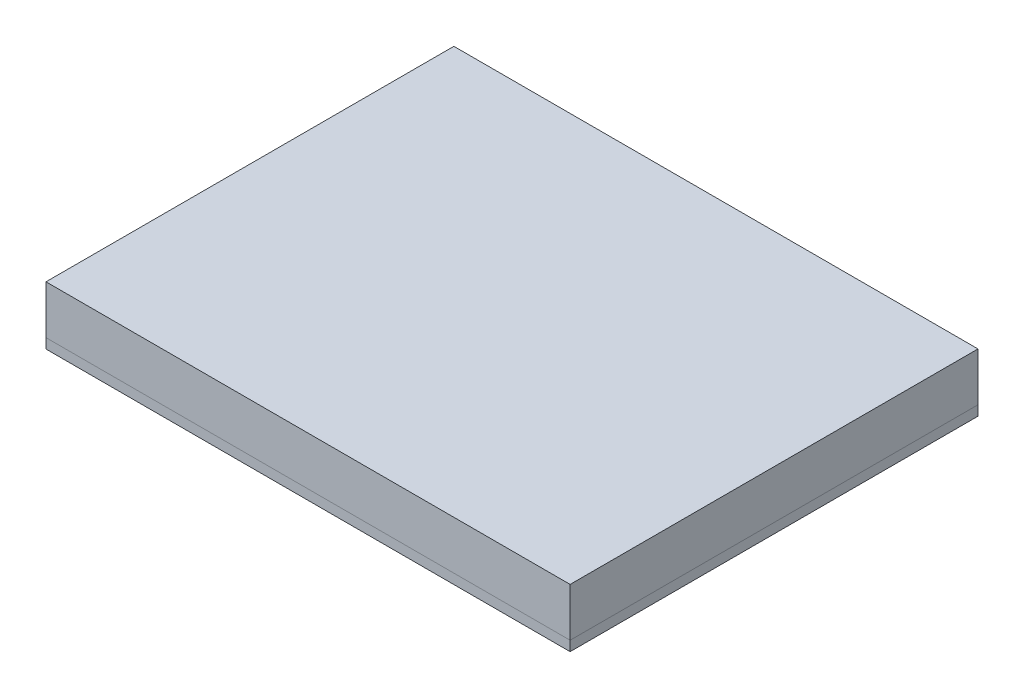
ISO-10303-21;
HEADER;
FILE_DESCRIPTION(('STEP AP214'),'2;1');
FILE_NAME('part.step','',(''),(''),'','','');
FILE_SCHEMA(('AUTOMOTIVE_DESIGN { 1 0 10303 214 1 1 1 1 }'));
ENDSEC;
DATA;
#1=APPLICATION_CONTEXT('core data for automotive mechanical design processes');
#2=APPLICATION_PROTOCOL_DEFINITION('international standard','automotive_design',2000,#1);
#3=PRODUCT_CONTEXT('',#1,'mechanical');
#4=PRODUCT('Part','Part','',(#3));
#5=PRODUCT_RELATED_PRODUCT_CATEGORY('part','',(#4));
#6=PRODUCT_DEFINITION_FORMATION('','',#4);
#7=PRODUCT_DEFINITION_CONTEXT('part definition',#1,'design');
#8=PRODUCT_DEFINITION('design','',#6,#7);
#9=PRODUCT_DEFINITION_SHAPE('','',#8);
#10=(LENGTH_UNIT() NAMED_UNIT(*) SI_UNIT(.MILLI.,.METRE.));
#11=(NAMED_UNIT(*) PLANE_ANGLE_UNIT() SI_UNIT($,.RADIAN.));
#12=(NAMED_UNIT(*) SI_UNIT($,.STERADIAN.) SOLID_ANGLE_UNIT());
#13=UNCERTAINTY_MEASURE_WITH_UNIT(LENGTH_MEASURE(1.E-05),#10,'distance_accuracy_value','');
#14=(GEOMETRIC_REPRESENTATION_CONTEXT(3) GLOBAL_UNCERTAINTY_ASSIGNED_CONTEXT((#13)) GLOBAL_UNIT_ASSIGNED_CONTEXT((#10,
#11,#12)) REPRESENTATION_CONTEXT('',''));
#15=CARTESIAN_POINT('',(0.,0.,0.));
#16=DIRECTION('',(0.,0.,1.));
#17=DIRECTION('',(1.,0.,0.));
#18=AXIS2_PLACEMENT_3D('',#15,#16,#17);
#19=CARTESIAN_POINT('',(0.,10.,-70.));
#20=DIRECTION('',(0.,0.,1.));
#21=DIRECTION('',(1.,0.,0.));
#22=AXIS2_PLACEMENT_3D('',#19,#20,#21);
#23=PLANE('',#22);
#24=DIRECTION('',(-1.,0.,0.));
#25=VECTOR('',#24,1.);
#26=CARTESIAN_POINT('',(0.,1.7,-70.));
#27=LINE('',#26,#25);
#28=CARTESIAN_POINT('',(89.95,1.7,-70.));
#29=VERTEX_POINT('',#28);
#30=CARTESIAN_POINT('',(0.,1.7,-70.));
#31=VERTEX_POINT('',#30);
#32=EDGE_CURVE('E107',#29,#31,#27,.T.);
#33=ORIENTED_EDGE('',*,*,#32,.T.);
#34=DIRECTION('',(0.,-1.,0.));
#35=VECTOR('',#34,1.);
#36=CARTESIAN_POINT('',(0.,10.,-70.));
#37=LINE('',#36,#35);
#38=CARTESIAN_POINT('',(0.,10.,-70.));
#39=VERTEX_POINT('',#38);
#40=EDGE_CURVE('E12',#39,#31,#37,.T.);
#41=ORIENTED_EDGE('',*,*,#40,.F.);
#42=DIRECTION('',(-1.,0.,0.));
#43=VECTOR('',#42,1.);
#44=CARTESIAN_POINT('',(0.,10.,-70.));
#45=LINE('',#44,#43);
#46=CARTESIAN_POINT('',(89.95,10.,-70.));
#47=VERTEX_POINT('',#46);
#48=EDGE_CURVE('E95',#47,#39,#45,.T.);
#49=ORIENTED_EDGE('',*,*,#48,.F.);
#50=DIRECTION('',(0.,-1.,0.));
#51=VECTOR('',#50,1.);
#52=CARTESIAN_POINT('',(89.95,10.,-70.));
#53=LINE('',#52,#51);
#54=EDGE_CURVE('E103',#47,#29,#53,.T.);
#55=ORIENTED_EDGE('',*,*,#54,.T.);
#56=EDGE_LOOP('',(#33,#41,#49,#55));
#57=FACE_BOUND('',#56,.T.);
#58=ADVANCED_FACE('F44',(#57),#23,.F.);
#59=CARTESIAN_POINT('',(0.,10.,0.));
#60=DIRECTION('',(1.,0.,0.));
#61=DIRECTION('',(0.,0.,-1.));
#62=AXIS2_PLACEMENT_3D('',#59,#60,#61);
#63=PLANE('',#62);
#64=DIRECTION('',(0.,0.,1.));
#65=VECTOR('',#64,1.);
#66=CARTESIAN_POINT('',(0.,1.7,0.));
#67=LINE('',#66,#65);
#68=CARTESIAN_POINT('',(0.,1.7,0.));
#69=VERTEX_POINT('',#68);
#70=EDGE_CURVE('E99',#31,#69,#67,.T.);
#71=ORIENTED_EDGE('',*,*,#70,.T.);
#72=DIRECTION('',(0.,-1.,0.));
#73=VECTOR('',#72,1.);
#74=CARTESIAN_POINT('',(0.,10.,0.));
#75=LINE('',#74,#73);
#76=CARTESIAN_POINT('',(0.,10.,0.));
#77=VERTEX_POINT('',#76);
#78=EDGE_CURVE('E52',#77,#69,#75,.T.);
#79=ORIENTED_EDGE('',*,*,#78,.F.);
#80=DIRECTION('',(0.,0.,1.));
#81=VECTOR('',#80,1.);
#82=CARTESIAN_POINT('',(0.,10.,0.));
#83=LINE('',#82,#81);
#84=EDGE_CURVE('E90',#39,#77,#83,.T.);
#85=ORIENTED_EDGE('',*,*,#84,.F.);
#86=ORIENTED_EDGE('',*,*,#40,.T.);
#87=EDGE_LOOP('',(#71,#79,#85,#86));
#88=FACE_BOUND('',#87,.T.);
#89=ADVANCED_FACE('F98',(#88),#63,.F.);
#90=CARTESIAN_POINT('',(0.,10.,0.));
#91=DIRECTION('',(0.,0.,-1.));
#92=DIRECTION('',(-1.,0.,0.));
#93=AXIS2_PLACEMENT_3D('',#90,#91,#92);
#94=PLANE('',#93);
#95=DIRECTION('',(1.,0.,0.));
#96=VECTOR('',#95,1.);
#97=CARTESIAN_POINT('',(0.,1.7,0.));
#98=LINE('',#97,#96);
#99=CARTESIAN_POINT('',(89.95,1.7,0.));
#100=VERTEX_POINT('',#99);
#101=EDGE_CURVE('E77',#69,#100,#98,.T.);
#102=ORIENTED_EDGE('',*,*,#101,.T.);
#103=DIRECTION('',(0.,-1.,0.));
#104=VECTOR('',#103,1.);
#105=CARTESIAN_POINT('',(89.95,10.,0.));
#106=LINE('',#105,#104);
#107=CARTESIAN_POINT('',(89.95,10.,0.));
#108=VERTEX_POINT('',#107);
#109=EDGE_CURVE('E100',#108,#100,#106,.T.);
#110=ORIENTED_EDGE('',*,*,#109,.F.);
#111=DIRECTION('',(1.,0.,0.));
#112=VECTOR('',#111,1.);
#113=CARTESIAN_POINT('',(0.,10.,0.));
#114=LINE('',#113,#112);
#115=EDGE_CURVE('E93',#77,#108,#114,.T.);
#116=ORIENTED_EDGE('',*,*,#115,.F.);
#117=ORIENTED_EDGE('',*,*,#78,.T.);
#118=EDGE_LOOP('',(#102,#110,#116,#117));
#119=FACE_BOUND('',#118,.T.);
#120=ADVANCED_FACE('F101',(#119),#94,.F.);
#121=CARTESIAN_POINT('',(89.95,10.,0.));
#122=DIRECTION('',(-1.,0.,0.));
#123=DIRECTION('',(0.,0.,1.));
#124=AXIS2_PLACEMENT_3D('',#121,#122,#123);
#125=PLANE('',#124);
#126=DIRECTION('',(0.,0.,-1.));
#127=VECTOR('',#126,1.);
#128=CARTESIAN_POINT('',(89.95,1.7,0.));
#129=LINE('',#128,#127);
#130=EDGE_CURVE('E83',#100,#29,#129,.T.);
#131=ORIENTED_EDGE('',*,*,#130,.T.);
#132=ORIENTED_EDGE('',*,*,#54,.F.);
#133=DIRECTION('',(0.,0.,-1.));
#134=VECTOR('',#133,1.);
#135=CARTESIAN_POINT('',(89.95,10.,0.));
#136=LINE('',#135,#134);
#137=EDGE_CURVE('E60',#108,#47,#136,.T.);
#138=ORIENTED_EDGE('',*,*,#137,.F.);
#139=ORIENTED_EDGE('',*,*,#109,.T.);
#140=EDGE_LOOP('',(#131,#132,#138,#139));
#141=FACE_BOUND('',#140,.T.);
#142=ADVANCED_FACE('F114',(#141),#125,.F.);
#143=CARTESIAN_POINT('',(0.,10.,0.));
#144=DIRECTION('',(0.,1.,0.));
#145=DIRECTION('',(0.,0.,1.));
#146=AXIS2_PLACEMENT_3D('',#143,#144,#145);
#147=PLANE('',#146);
#148=ORIENTED_EDGE('',*,*,#48,.T.);
#149=ORIENTED_EDGE('',*,*,#84,.T.);
#150=ORIENTED_EDGE('',*,*,#115,.T.);
#151=ORIENTED_EDGE('',*,*,#137,.T.);
#152=EDGE_LOOP('',(#148,#149,#150,#151));
#153=FACE_BOUND('',#152,.T.);
#154=ADVANCED_FACE('F91',(#153),#147,.T.);
#155=CARTESIAN_POINT('',(0.,1.7,0.));
#156=DIRECTION('',(0.,1.,0.));
#157=DIRECTION('',(0.,0.,1.));
#158=AXIS2_PLACEMENT_3D('',#155,#156,#157);
#159=PLANE('',#158);
#160=ORIENTED_EDGE('',*,*,#32,.F.);
#161=ORIENTED_EDGE('',*,*,#130,.F.);
#162=ORIENTED_EDGE('',*,*,#101,.F.);
#163=ORIENTED_EDGE('',*,*,#70,.F.);
#164=EDGE_LOOP('',(#160,#161,#162,#163));
#165=FACE_BOUND('',#164,.T.);
#166=ADVANCED_FACE('F117',(#165),#159,.F.);
#167=CLOSED_SHELL('',(#58,#89,#120,#142,#154,#166));
#168=MANIFOLD_SOLID_BREP('B2',#167);
#169=CARTESIAN_POINT('',(0.,1.7,0.));
#170=DIRECTION('',(1.,0.,0.));
#171=DIRECTION('',(0.,0.,-1.));
#172=AXIS2_PLACEMENT_3D('',#169,#170,#171);
#173=PLANE('',#172);
#174=DIRECTION('',(0.,0.,1.));
#175=VECTOR('',#174,1.);
#176=CARTESIAN_POINT('',(0.,0.,0.));
#177=LINE('',#176,#175);
#178=CARTESIAN_POINT('',(0.,0.,-70.));
#179=VERTEX_POINT('',#178);
#180=CARTESIAN_POINT('',(0.,0.,0.));
#181=VERTEX_POINT('',#180);
#182=EDGE_CURVE('E230',#179,#181,#177,.T.);
#183=ORIENTED_EDGE('',*,*,#182,.T.);
#184=DIRECTION('',(0.,-1.,0.));
#185=VECTOR('',#184,1.);
#186=CARTESIAN_POINT('',(0.,1.7,0.));
#187=LINE('',#186,#185);
#188=CARTESIAN_POINT('',(0.,1.7,0.));
#189=VERTEX_POINT('',#188);
#190=EDGE_CURVE('E42',#189,#181,#187,.T.);
#191=ORIENTED_EDGE('',*,*,#190,.F.);
#192=DIRECTION('',(0.,0.,1.));
#193=VECTOR('',#192,1.);
#194=CARTESIAN_POINT('',(0.,1.7,0.));
#195=LINE('',#194,#193);
#196=CARTESIAN_POINT('',(0.,1.7,-70.));
#197=VERTEX_POINT('',#196);
#198=EDGE_CURVE('E218',#197,#189,#195,.T.);
#199=ORIENTED_EDGE('',*,*,#198,.F.);
#200=DIRECTION('',(0.,-1.,0.));
#201=VECTOR('',#200,1.);
#202=CARTESIAN_POINT('',(0.,1.7,-70.));
#203=LINE('',#202,#201);
#204=EDGE_CURVE('E226',#197,#179,#203,.T.);
#205=ORIENTED_EDGE('',*,*,#204,.T.);
#206=EDGE_LOOP('',(#183,#191,#199,#205));
#207=FACE_BOUND('',#206,.T.);
#208=ADVANCED_FACE('F167',(#207),#173,.F.);
#209=CARTESIAN_POINT('',(0.,1.7,0.));
#210=DIRECTION('',(0.,0.,-1.));
#211=DIRECTION('',(-1.,0.,0.));
#212=AXIS2_PLACEMENT_3D('',#209,#210,#211);
#213=PLANE('',#212);
#214=DIRECTION('',(1.,0.,0.));
#215=VECTOR('',#214,1.);
#216=CARTESIAN_POINT('',(0.,0.,0.));
#217=LINE('',#216,#215);
#218=CARTESIAN_POINT('',(89.95,0.,0.));
#219=VERTEX_POINT('',#218);
#220=EDGE_CURVE('E222',#181,#219,#217,.T.);
#221=ORIENTED_EDGE('',*,*,#220,.T.);
#222=DIRECTION('',(0.,-1.,0.));
#223=VECTOR('',#222,1.);
#224=CARTESIAN_POINT('',(89.95,1.7,0.));
#225=LINE('',#224,#223);
#226=CARTESIAN_POINT('',(89.95,1.7,0.));
#227=VERTEX_POINT('',#226);
#228=EDGE_CURVE('E175',#227,#219,#225,.T.);
#229=ORIENTED_EDGE('',*,*,#228,.F.);
#230=DIRECTION('',(1.,0.,0.));
#231=VECTOR('',#230,1.);
#232=CARTESIAN_POINT('',(0.,1.7,0.));
#233=LINE('',#232,#231);
#234=EDGE_CURVE('E213',#189,#227,#233,.T.);
#235=ORIENTED_EDGE('',*,*,#234,.F.);
#236=ORIENTED_EDGE('',*,*,#190,.T.);
#237=EDGE_LOOP('',(#221,#229,#235,#236));
#238=FACE_BOUND('',#237,.T.);
#239=ADVANCED_FACE('F221',(#238),#213,.F.);
#240=CARTESIAN_POINT('',(89.95,1.7,0.));
#241=DIRECTION('',(-1.,0.,0.));
#242=DIRECTION('',(0.,0.,1.));
#243=AXIS2_PLACEMENT_3D('',#240,#241,#242);
#244=PLANE('',#243);
#245=DIRECTION('',(0.,0.,-1.));
#246=VECTOR('',#245,1.);
#247=CARTESIAN_POINT('',(89.95,0.,0.));
#248=LINE('',#247,#246);
#249=CARTESIAN_POINT('',(89.95,0.,-70.));
#250=VERTEX_POINT('',#249);
#251=EDGE_CURVE('E200',#219,#250,#248,.T.);
#252=ORIENTED_EDGE('',*,*,#251,.T.);
#253=DIRECTION('',(0.,-1.,0.));
#254=VECTOR('',#253,1.);
#255=CARTESIAN_POINT('',(89.95,1.7,-70.));
#256=LINE('',#255,#254);
#257=CARTESIAN_POINT('',(89.95,1.7,-70.));
#258=VERTEX_POINT('',#257);
#259=EDGE_CURVE('E223',#258,#250,#256,.T.);
#260=ORIENTED_EDGE('',*,*,#259,.F.);
#261=DIRECTION('',(0.,0.,-1.));
#262=VECTOR('',#261,1.);
#263=CARTESIAN_POINT('',(89.95,1.7,0.));
#264=LINE('',#263,#262);
#265=EDGE_CURVE('E216',#227,#258,#264,.T.);
#266=ORIENTED_EDGE('',*,*,#265,.F.);
#267=ORIENTED_EDGE('',*,*,#228,.T.);
#268=EDGE_LOOP('',(#252,#260,#266,#267));
#269=FACE_BOUND('',#268,.T.);
#270=ADVANCED_FACE('F224',(#269),#244,.F.);
#271=CARTESIAN_POINT('',(0.,1.7,-70.));
#272=DIRECTION('',(0.,0.,1.));
#273=DIRECTION('',(1.,0.,0.));
#274=AXIS2_PLACEMENT_3D('',#271,#272,#273);
#275=PLANE('',#274);
#276=DIRECTION('',(-1.,0.,0.));
#277=VECTOR('',#276,1.);
#278=CARTESIAN_POINT('',(0.,0.,-70.));
#279=LINE('',#278,#277);
#280=EDGE_CURVE('E206',#250,#179,#279,.T.);
#281=ORIENTED_EDGE('',*,*,#280,.T.);
#282=ORIENTED_EDGE('',*,*,#204,.F.);
#283=DIRECTION('',(-1.,0.,0.));
#284=VECTOR('',#283,1.);
#285=CARTESIAN_POINT('',(0.,1.7,-70.));
#286=LINE('',#285,#284);
#287=EDGE_CURVE('E183',#258,#197,#286,.T.);
#288=ORIENTED_EDGE('',*,*,#287,.F.);
#289=ORIENTED_EDGE('',*,*,#259,.T.);
#290=EDGE_LOOP('',(#281,#282,#288,#289));
#291=FACE_BOUND('',#290,.T.);
#292=ADVANCED_FACE('F237',(#291),#275,.F.);
#293=CARTESIAN_POINT('',(0.,1.7,0.));
#294=DIRECTION('',(0.,-1.,0.));
#295=DIRECTION('',(0.,0.,-1.));
#296=AXIS2_PLACEMENT_3D('',#293,#294,#295);
#297=PLANE('',#296);
#298=ORIENTED_EDGE('',*,*,#198,.T.);
#299=ORIENTED_EDGE('',*,*,#234,.T.);
#300=ORIENTED_EDGE('',*,*,#265,.T.);
#301=ORIENTED_EDGE('',*,*,#287,.T.);
#302=EDGE_LOOP('',(#298,#299,#300,#301));
#303=FACE_BOUND('',#302,.T.);
#304=ADVANCED_FACE('F214',(#303),#297,.F.);
#305=CARTESIAN_POINT('',(0.,0.,0.));
#306=DIRECTION('',(0.,-1.,0.));
#307=DIRECTION('',(0.,0.,-1.));
#308=AXIS2_PLACEMENT_3D('',#305,#306,#307);
#309=PLANE('',#308);
#310=ORIENTED_EDGE('',*,*,#182,.F.);
#311=ORIENTED_EDGE('',*,*,#280,.F.);
#312=ORIENTED_EDGE('',*,*,#251,.F.);
#313=ORIENTED_EDGE('',*,*,#220,.F.);
#314=EDGE_LOOP('',(#310,#311,#312,#313));
#315=FACE_BOUND('',#314,.T.);
#316=ADVANCED_FACE('F240',(#315),#309,.T.);
#317=CLOSED_SHELL('',(#208,#239,#270,#292,#304,#316));
#318=MANIFOLD_SOLID_BREP('B6',#317);
#319=ADVANCED_BREP_SHAPE_REPRESENTATION('',(#18,#168,#318),#14);
#320=SHAPE_DEFINITION_REPRESENTATION(#9,#319);
ENDSEC;
END-ISO-10303-21;
